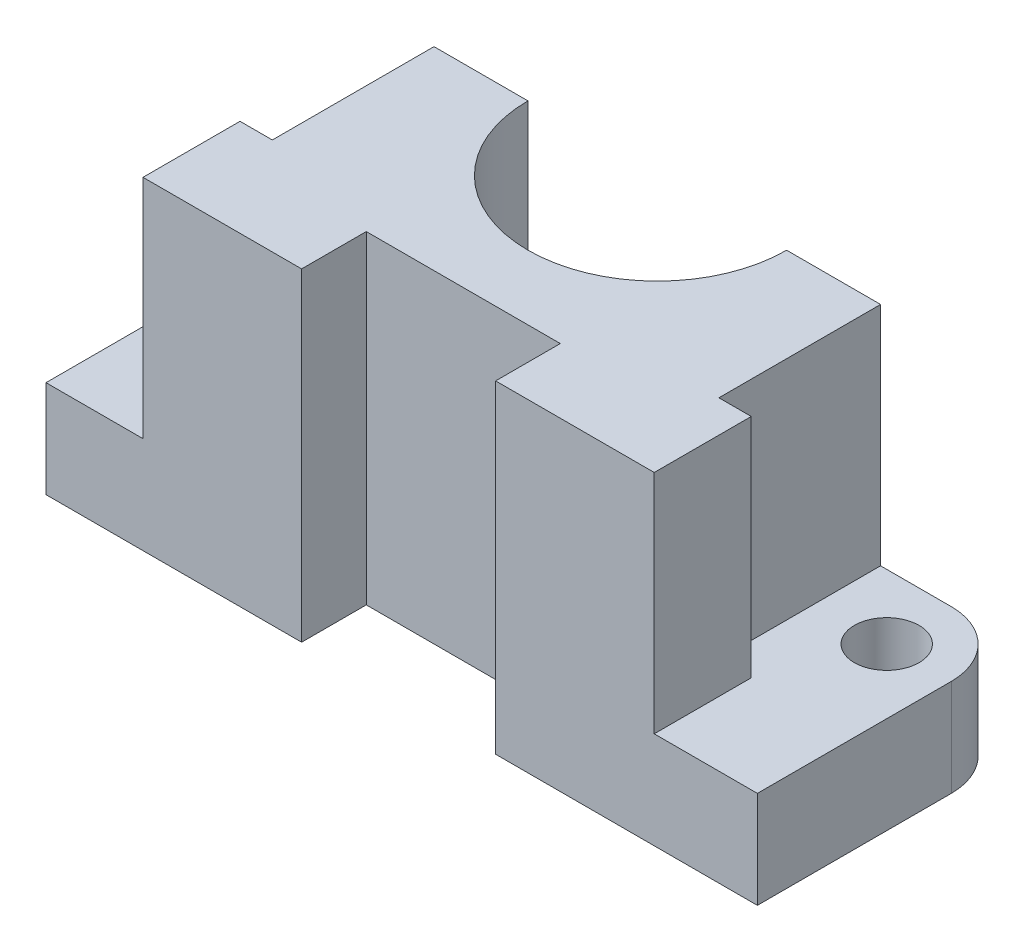
ISO-10303-21;
HEADER;
FILE_DESCRIPTION(('STEP AP214'),'2;1');
FILE_NAME('part.step','',(''),(''),'','','');
FILE_SCHEMA(('AUTOMOTIVE_DESIGN { 1 0 10303 214 1 1 1 1 }'));
ENDSEC;
DATA;
#1=APPLICATION_CONTEXT('core data for automotive mechanical design processes');
#2=APPLICATION_PROTOCOL_DEFINITION('international standard','automotive_design',2000,#1);
#3=PRODUCT_CONTEXT('',#1,'mechanical');
#4=PRODUCT('Part','Part','',(#3));
#5=PRODUCT_RELATED_PRODUCT_CATEGORY('part','',(#4));
#6=PRODUCT_DEFINITION_FORMATION('','',#4);
#7=PRODUCT_DEFINITION_CONTEXT('part definition',#1,'design');
#8=PRODUCT_DEFINITION('design','',#6,#7);
#9=PRODUCT_DEFINITION_SHAPE('','',#8);
#10=(LENGTH_UNIT() NAMED_UNIT(*) SI_UNIT(.MILLI.,.METRE.));
#11=(NAMED_UNIT(*) PLANE_ANGLE_UNIT() SI_UNIT($,.RADIAN.));
#12=(NAMED_UNIT(*) SI_UNIT($,.STERADIAN.) SOLID_ANGLE_UNIT());
#13=UNCERTAINTY_MEASURE_WITH_UNIT(LENGTH_MEASURE(1.E-05),#10,'distance_accuracy_value','');
#14=(GEOMETRIC_REPRESENTATION_CONTEXT(3) GLOBAL_UNCERTAINTY_ASSIGNED_CONTEXT((#13)) GLOBAL_UNIT_ASSIGNED_CONTEXT((#10,
#11,#12)) REPRESENTATION_CONTEXT('',''));
#15=CARTESIAN_POINT('',(0.,0.,0.));
#16=DIRECTION('',(0.,0.,1.));
#17=DIRECTION('',(1.,0.,0.));
#18=AXIS2_PLACEMENT_3D('',#15,#16,#17);
#19=CARTESIAN_POINT('',(99.9999999999999,50.,-40.));
#20=DIRECTION('',(0.,0.,1.));
#21=DIRECTION('',(1.,0.,0.));
#22=AXIS2_PLACEMENT_3D('',#19,#20,#21);
#23=PLANE('',#22);
#24=DIRECTION('',(-1.,0.,0.));
#25=VECTOR('',#24,1.);
#26=CARTESIAN_POINT('',(99.9999999999999,0.,-40.));
#27=LINE('',#26,#25);
#28=CARTESIAN_POINT('',(99.9999999999999,0.,-40.));
#29=VERTEX_POINT('',#28);
#30=CARTESIAN_POINT('',(64.5261628445037,0.,-40.));
#31=VERTEX_POINT('',#30);
#32=EDGE_CURVE('E213',#29,#31,#27,.T.);
#33=ORIENTED_EDGE('',*,*,#32,.T.);
#34=DIRECTION('',(0.,1.,0.));
#35=VECTOR('',#34,1.);
#36=CARTESIAN_POINT('',(64.5261628445037,0.,-40.));
#37=LINE('',#36,#35);
#38=CARTESIAN_POINT('',(64.5261628445037,30.,-40.));
#39=VERTEX_POINT('',#38);
#40=EDGE_CURVE('E192',#31,#39,#37,.T.);
#41=ORIENTED_EDGE('',*,*,#40,.T.);
#42=DIRECTION('',(-1.,0.,0.));
#43=VECTOR('',#42,1.);
#44=CARTESIAN_POINT('',(0.,30.,-40.));
#45=LINE('',#44,#43);
#46=CARTESIAN_POINT('',(74.5261628445037,30.,-40.));
#47=VERTEX_POINT('',#46);
#48=EDGE_CURVE('E439',#47,#39,#45,.T.);
#49=ORIENTED_EDGE('',*,*,#48,.F.);
#50=DIRECTION('',(0.,1.,0.));
#51=VECTOR('',#50,1.);
#52=CARTESIAN_POINT('',(74.5261628445037,30.,-40.));
#53=LINE('',#52,#51);
#54=CARTESIAN_POINT('',(74.5261628445037,50.,-40.));
#55=VERTEX_POINT('',#54);
#56=EDGE_CURVE('E436',#47,#55,#53,.T.);
#57=ORIENTED_EDGE('',*,*,#56,.T.);
#58=DIRECTION('',(-1.,0.,0.));
#59=VECTOR('',#58,1.);
#60=CARTESIAN_POINT('',(99.9999999999999,50.,-40.));
#61=LINE('',#60,#59);
#62=CARTESIAN_POINT('',(89.0523256890073,50.,-40.));
#63=VERTEX_POINT('',#62);
#64=EDGE_CURVE('E226',#63,#55,#61,.T.);
#65=ORIENTED_EDGE('',*,*,#64,.F.);
#66=DIRECTION('',(0.,1.,0.));
#67=VECTOR('',#66,1.);
#68=CARTESIAN_POINT('',(89.0523256890073,15.,-40.));
#69=LINE('',#68,#67);
#70=CARTESIAN_POINT('',(89.0523256890073,15.,-40.));
#71=VERTEX_POINT('',#70);
#72=EDGE_CURVE('E357',#71,#63,#69,.T.);
#73=ORIENTED_EDGE('',*,*,#72,.F.);
#74=DIRECTION('',(-1.,0.,0.));
#75=VECTOR('',#74,1.);
#76=CARTESIAN_POINT('',(0.,15.,-40.));
#77=LINE('',#76,#75);
#78=CARTESIAN_POINT('',(99.9999999999999,15.,-40.));
#79=VERTEX_POINT('',#78);
#80=EDGE_CURVE('E334',#79,#71,#77,.T.);
#81=ORIENTED_EDGE('',*,*,#80,.F.);
#82=DIRECTION('',(0.,-1.,0.));
#83=VECTOR('',#82,1.);
#84=CARTESIAN_POINT('',(99.9999999999999,50.,-40.));
#85=LINE('',#84,#83);
#86=EDGE_CURVE('E228',#79,#29,#85,.T.);
#87=ORIENTED_EDGE('',*,*,#86,.T.);
#88=EDGE_LOOP('',(#33,#41,#49,#57,#65,#73,#81,#87));
#89=FACE_BOUND('',#88,.T.);
#90=ADVANCED_FACE('F41',(#89),#23,.F.);
#91=CARTESIAN_POINT('',(100.,50.,-30.));
#92=DIRECTION('',(0.,1.,0.));
#93=DIRECTION('',(0.,0.,1.));
#94=AXIS2_PLACEMENT_3D('',#91,#92,#93);
#95=PLANE('',#94);
#96=CARTESIAN_POINT('',(54.5261628445037,50.,-40.));
#97=DIRECTION('',(0.,1.,0.));
#98=DIRECTION('',(0.,0.,1.));
#99=AXIS2_PLACEMENT_3D('',#96,#97,#98);
#100=CIRCLE('',#99,20.);
#101=CARTESIAN_POINT('',(34.5261628445037,50.,-40.));
#102=VERTEX_POINT('',#101);
#103=EDGE_CURVE('E430',#102,#55,#100,.T.);
#104=ORIENTED_EDGE('',*,*,#103,.F.);
#105=CARTESIAN_POINT('',(20.,50.,-40.));
#106=VERTEX_POINT('',#105);
#107=EDGE_CURVE('E308',#102,#106,#61,.T.);
#108=ORIENTED_EDGE('',*,*,#107,.T.);
#109=DIRECTION('',(0.,0.,1.));
#110=VECTOR('',#109,1.);
#111=CARTESIAN_POINT('',(20.,50.,-30.));
#112=LINE('',#111,#110);
#113=CARTESIAN_POINT('',(20.,50.,-15.));
#114=VERTEX_POINT('',#113);
#115=EDGE_CURVE('E244',#106,#114,#112,.T.);
#116=ORIENTED_EDGE('',*,*,#115,.T.);
#117=DIRECTION('',(-1.,0.,0.));
#118=VECTOR('',#117,1.);
#119=CARTESIAN_POINT('',(100.,50.,-15.));
#120=LINE('',#119,#118);
#121=CARTESIAN_POINT('',(15.,50.,-15.));
#122=VERTEX_POINT('',#121);
#123=EDGE_CURVE('E49',#114,#122,#120,.T.);
#124=ORIENTED_EDGE('',*,*,#123,.T.);
#125=DIRECTION('',(0.,0.,1.));
#126=VECTOR('',#125,1.);
#127=CARTESIAN_POINT('',(15.,50.,-30.));
#128=LINE('',#127,#126);
#129=CARTESIAN_POINT('',(15.,50.,0.));
#130=VERTEX_POINT('',#129);
#131=EDGE_CURVE('E241',#122,#130,#128,.T.);
#132=ORIENTED_EDGE('',*,*,#131,.T.);
#133=DIRECTION('',(1.,0.,0.));
#134=VECTOR('',#133,1.);
#135=CARTESIAN_POINT('',(0.,50.,0.));
#136=LINE('',#135,#134);
#137=CARTESIAN_POINT('',(39.5261628445037,50.,0.));
#138=VERTEX_POINT('',#137);
#139=EDGE_CURVE('E306',#130,#138,#136,.T.);
#140=ORIENTED_EDGE('',*,*,#139,.T.);
#141=DIRECTION('',(0.,0.,-1.));
#142=VECTOR('',#141,1.);
#143=CARTESIAN_POINT('',(39.5261628445037,50.,-30.));
#144=LINE('',#143,#142);
#145=CARTESIAN_POINT('',(39.5261628445037,50.,-10.));
#146=VERTEX_POINT('',#145);
#147=EDGE_CURVE('E294',#138,#146,#144,.T.);
#148=ORIENTED_EDGE('',*,*,#147,.T.);
#149=DIRECTION('',(-1.,0.,0.));
#150=VECTOR('',#149,1.);
#151=CARTESIAN_POINT('',(100.,50.,-10.));
#152=LINE('',#151,#150);
#153=CARTESIAN_POINT('',(69.5261628445037,50.,-10.));
#154=VERTEX_POINT('',#153);
#155=EDGE_CURVE('E297',#154,#146,#152,.T.);
#156=ORIENTED_EDGE('',*,*,#155,.F.);
#157=DIRECTION('',(0.,0.,-1.));
#158=VECTOR('',#157,1.);
#159=CARTESIAN_POINT('',(69.5261628445037,50.,-30.));
#160=LINE('',#159,#158);
#161=CARTESIAN_POINT('',(69.5261628445037,50.,0.));
#162=VERTEX_POINT('',#161);
#163=EDGE_CURVE('E285',#162,#154,#160,.T.);
#164=ORIENTED_EDGE('',*,*,#163,.F.);
#165=CARTESIAN_POINT('',(94.0523256890073,50.,0.));
#166=VERTEX_POINT('',#165);
#167=EDGE_CURVE('E222',#162,#166,#136,.T.);
#168=ORIENTED_EDGE('',*,*,#167,.T.);
#169=DIRECTION('',(0.,0.,-1.));
#170=VECTOR('',#169,1.);
#171=CARTESIAN_POINT('',(94.0523256890073,50.,-30.));
#172=LINE('',#171,#170);
#173=CARTESIAN_POINT('',(94.0523256890073,50.,-15.));
#174=VERTEX_POINT('',#173);
#175=EDGE_CURVE('E269',#166,#174,#172,.T.);
#176=ORIENTED_EDGE('',*,*,#175,.T.);
#177=DIRECTION('',(-1.,0.,0.));
#178=VECTOR('',#177,1.);
#179=CARTESIAN_POINT('',(100.,50.,-15.));
#180=LINE('',#179,#178);
#181=CARTESIAN_POINT('',(89.0523256890073,50.,-15.));
#182=VERTEX_POINT('',#181);
#183=EDGE_CURVE('E11',#174,#182,#180,.T.);
#184=ORIENTED_EDGE('',*,*,#183,.T.);
#185=DIRECTION('',(0.,0.,-1.));
#186=VECTOR('',#185,1.);
#187=CARTESIAN_POINT('',(89.0523256890073,50.,-30.));
#188=LINE('',#187,#186);
#189=EDGE_CURVE('E261',#182,#63,#188,.T.);
#190=ORIENTED_EDGE('',*,*,#189,.T.);
#191=ORIENTED_EDGE('',*,*,#64,.T.);
#192=EDGE_LOOP('',(#104,#108,#116,#124,#132,#140,#148,#156,#164,#168,#176,#184,#190,#191));
#193=FACE_BOUND('',#192,.T.);
#194=ADVANCED_FACE('F240',(#193),#95,.T.);
#195=CARTESIAN_POINT('',(0.,50.,0.));
#196=DIRECTION('',(0.,0.,-1.));
#197=DIRECTION('',(-1.,0.,0.));
#198=AXIS2_PLACEMENT_3D('',#195,#196,#197);
#199=PLANE('',#198);
#200=DIRECTION('',(0.,-1.,0.));
#201=VECTOR('',#200,1.);
#202=CARTESIAN_POINT('',(15.,50.000012,0.));
#203=LINE('',#202,#201);
#204=CARTESIAN_POINT('',(15.,15.,0.));
#205=VERTEX_POINT('',#204);
#206=EDGE_CURVE('E263',#130,#205,#203,.T.);
#207=ORIENTED_EDGE('',*,*,#206,.T.);
#208=DIRECTION('',(1.,0.,0.));
#209=VECTOR('',#208,1.);
#210=CARTESIAN_POINT('',(0.,15.,0.));
#211=LINE('',#210,#209);
#212=CARTESIAN_POINT('',(0.,15.,0.));
#213=VERTEX_POINT('',#212);
#214=EDGE_CURVE('E372',#213,#205,#211,.T.);
#215=ORIENTED_EDGE('',*,*,#214,.F.);
#216=DIRECTION('',(0.,-1.,0.));
#217=VECTOR('',#216,1.);
#218=CARTESIAN_POINT('',(0.,50.,0.));
#219=LINE('',#218,#217);
#220=CARTESIAN_POINT('',(0.,0.,0.));
#221=VERTEX_POINT('',#220);
#222=EDGE_CURVE('E234',#213,#221,#219,.T.);
#223=ORIENTED_EDGE('',*,*,#222,.T.);
#224=DIRECTION('',(1.,0.,0.));
#225=VECTOR('',#224,1.);
#226=CARTESIAN_POINT('',(0.,0.,0.));
#227=LINE('',#226,#225);
#228=CARTESIAN_POINT('',(39.5261628445037,0.,0.));
#229=VERTEX_POINT('',#228);
#230=EDGE_CURVE('E314',#221,#229,#227,.T.);
#231=ORIENTED_EDGE('',*,*,#230,.T.);
#232=DIRECTION('',(0.,1.,0.));
#233=VECTOR('',#232,1.);
#234=CARTESIAN_POINT('',(39.5261628445037,0.,0.));
#235=LINE('',#234,#233);
#236=EDGE_CURVE('E281',#229,#138,#235,.T.);
#237=ORIENTED_EDGE('',*,*,#236,.T.);
#238=ORIENTED_EDGE('',*,*,#139,.F.);
#239=EDGE_LOOP('',(#207,#215,#223,#231,#237,#238));
#240=FACE_BOUND('',#239,.T.);
#241=ADVANCED_FACE('F380',(#240),#199,.F.);
#242=CARTESIAN_POINT('',(0.,50.,-29.9999999999999));
#243=DIRECTION('',(1.,0.,0.));
#244=DIRECTION('',(0.,0.,-1.));
#245=AXIS2_PLACEMENT_3D('',#242,#243,#244);
#246=PLANE('',#245);
#247=DIRECTION('',(0.,0.,1.));
#248=VECTOR('',#247,1.);
#249=CARTESIAN_POINT('',(0.,15.,0.));
#250=LINE('',#249,#248);
#251=CARTESIAN_POINT('',(0.,15.,-29.9999999999999));
#252=VERTEX_POINT('',#251);
#253=EDGE_CURVE('E370',#252,#213,#250,.T.);
#254=ORIENTED_EDGE('',*,*,#253,.F.);
#255=DIRECTION('',(0.,-1.,0.));
#256=VECTOR('',#255,1.);
#257=CARTESIAN_POINT('',(0.,50.,-29.9999999999999));
#258=LINE('',#257,#256);
#259=CARTESIAN_POINT('',(0.,0.,-29.9999999999999));
#260=VERTEX_POINT('',#259);
#261=EDGE_CURVE('E223',#252,#260,#258,.T.);
#262=ORIENTED_EDGE('',*,*,#261,.T.);
#263=DIRECTION('',(0.,0.,1.));
#264=VECTOR('',#263,1.);
#265=CARTESIAN_POINT('',(0.,0.,-29.9999999999999));
#266=LINE('',#265,#264);
#267=EDGE_CURVE('E305',#260,#221,#266,.T.);
#268=ORIENTED_EDGE('',*,*,#267,.T.);
#269=ORIENTED_EDGE('',*,*,#222,.F.);
#270=EDGE_LOOP('',(#254,#262,#268,#269));
#271=FACE_BOUND('',#270,.T.);
#272=ADVANCED_FACE('F43',(#271),#246,.F.);
#273=DIRECTION('',(0.,1.,0.));
#274=VECTOR('',#273,1.);
#275=CARTESIAN_POINT('',(94.0523256890073,15.,0.));
#276=LINE('',#275,#274);
#277=CARTESIAN_POINT('',(94.0523256890073,15.,0.));
#278=VERTEX_POINT('',#277);
#279=EDGE_CURVE('E349',#278,#166,#276,.T.);
#280=ORIENTED_EDGE('',*,*,#279,.T.);
#281=ORIENTED_EDGE('',*,*,#167,.F.);
#282=DIRECTION('',(0.,1.,0.));
#283=VECTOR('',#282,1.);
#284=CARTESIAN_POINT('',(69.5261628445037,0.,0.));
#285=LINE('',#284,#283);
#286=CARTESIAN_POINT('',(69.5261628445037,0.,0.));
#287=VERTEX_POINT('',#286);
#288=EDGE_CURVE('E289',#287,#162,#285,.T.);
#289=ORIENTED_EDGE('',*,*,#288,.F.);
#290=CARTESIAN_POINT('',(110.,0.,0.));
#291=VERTEX_POINT('',#290);
#292=EDGE_CURVE('E313',#287,#291,#227,.T.);
#293=ORIENTED_EDGE('',*,*,#292,.T.);
#294=DIRECTION('',(0.,-1.,0.));
#295=VECTOR('',#294,1.);
#296=CARTESIAN_POINT('',(110.,50.,0.));
#297=LINE('',#296,#295);
#298=CARTESIAN_POINT('',(110.,15.,0.));
#299=VERTEX_POINT('',#298);
#300=EDGE_CURVE('E232',#299,#291,#297,.T.);
#301=ORIENTED_EDGE('',*,*,#300,.F.);
#302=DIRECTION('',(1.,0.,0.));
#303=VECTOR('',#302,1.);
#304=CARTESIAN_POINT('',(0.,15.,0.));
#305=LINE('',#304,#303);
#306=EDGE_CURVE('E339',#278,#299,#305,.T.);
#307=ORIENTED_EDGE('',*,*,#306,.F.);
#308=EDGE_LOOP('',(#280,#281,#289,#293,#301,#307));
#309=FACE_BOUND('',#308,.T.);
#310=ADVANCED_FACE('F410',(#309),#199,.F.);
#311=CARTESIAN_POINT('',(110.,50.,0.));
#312=DIRECTION('',(-1.,0.,0.));
#313=DIRECTION('',(0.,0.,1.));
#314=AXIS2_PLACEMENT_3D('',#311,#312,#313);
#315=PLANE('',#314);
#316=DIRECTION('',(0.,0.,-1.));
#317=VECTOR('',#316,1.);
#318=CARTESIAN_POINT('',(110.,15.,0.));
#319=LINE('',#318,#317);
#320=CARTESIAN_POINT('',(110.,15.,-29.9999999999999));
#321=VERTEX_POINT('',#320);
#322=EDGE_CURVE('E335',#299,#321,#319,.T.);
#323=ORIENTED_EDGE('',*,*,#322,.F.);
#324=ORIENTED_EDGE('',*,*,#300,.T.);
#325=DIRECTION('',(0.,0.,-1.));
#326=VECTOR('',#325,1.);
#327=CARTESIAN_POINT('',(110.,0.,0.));
#328=LINE('',#327,#326);
#329=CARTESIAN_POINT('',(110.,0.,-29.9999999999999));
#330=VERTEX_POINT('',#329);
#331=EDGE_CURVE('E217',#291,#330,#328,.T.);
#332=ORIENTED_EDGE('',*,*,#331,.T.);
#333=DIRECTION('',(0.,-1.,0.));
#334=VECTOR('',#333,1.);
#335=CARTESIAN_POINT('',(110.,50.,-29.9999999999999));
#336=LINE('',#335,#334);
#337=EDGE_CURVE('E230',#321,#330,#336,.T.);
#338=ORIENTED_EDGE('',*,*,#337,.F.);
#339=EDGE_LOOP('',(#323,#324,#332,#338));
#340=FACE_BOUND('',#339,.T.);
#341=ADVANCED_FACE('F322',(#340),#315,.F.);
#342=CARTESIAN_POINT('',(100.,50.,-30.));
#343=DIRECTION('',(0.,-1.,0.));
#344=DIRECTION('',(0.,0.,-1.));
#345=AXIS2_PLACEMENT_3D('',#342,#343,#344);
#346=CYLINDRICAL_SURFACE('',#345,10.);
#347=CARTESIAN_POINT('',(100.,15.,-30.));
#348=DIRECTION('',(0.,1.,0.));
#349=DIRECTION('',(0.,0.,1.));
#350=AXIS2_PLACEMENT_3D('',#347,#348,#349);
#351=CIRCLE('',#350,10.);
#352=EDGE_CURVE('E330',#321,#79,#351,.T.);
#353=ORIENTED_EDGE('',*,*,#352,.F.);
#354=ORIENTED_EDGE('',*,*,#337,.T.);
#355=CARTESIAN_POINT('',(100.,0.,-30.));
#356=DIRECTION('',(0.,1.,0.));
#357=DIRECTION('',(0.,0.,1.));
#358=AXIS2_PLACEMENT_3D('',#355,#356,#357);
#359=CIRCLE('',#358,10.);
#360=EDGE_CURVE('E214',#330,#29,#359,.T.);
#361=ORIENTED_EDGE('',*,*,#360,.T.);
#362=ORIENTED_EDGE('',*,*,#86,.F.);
#363=EDGE_LOOP('',(#353,#354,#361,#362));
#364=FACE_BOUND('',#363,.T.);
#365=ADVANCED_FACE('F329',(#364),#346,.T.);
#366=CARTESIAN_POINT('',(44.5261628445037,30.,-40.));
#367=VERTEX_POINT('',#366);
#368=CARTESIAN_POINT('',(34.5261628445037,30.,-40.));
#369=VERTEX_POINT('',#368);
#370=EDGE_CURVE('E206',#367,#369,#45,.T.);
#371=ORIENTED_EDGE('',*,*,#370,.F.);
#372=DIRECTION('',(0.,1.,0.));
#373=VECTOR('',#372,1.);
#374=CARTESIAN_POINT('',(44.5261628445037,0.,-40.));
#375=LINE('',#374,#373);
#376=CARTESIAN_POINT('',(44.5261628445037,0.,-40.));
#377=VERTEX_POINT('',#376);
#378=EDGE_CURVE('E56',#377,#367,#375,.T.);
#379=ORIENTED_EDGE('',*,*,#378,.F.);
#380=CARTESIAN_POINT('',(10.0000000000001,0.,-40.));
#381=VERTEX_POINT('',#380);
#382=EDGE_CURVE('E203',#377,#381,#27,.T.);
#383=ORIENTED_EDGE('',*,*,#382,.T.);
#384=DIRECTION('',(0.,-1.,0.));
#385=VECTOR('',#384,1.);
#386=CARTESIAN_POINT('',(10.0000000000001,50.,-40.));
#387=LINE('',#386,#385);
#388=CARTESIAN_POINT('',(10.0000000000001,15.,-40.));
#389=VERTEX_POINT('',#388);
#390=EDGE_CURVE('E225',#389,#381,#387,.T.);
#391=ORIENTED_EDGE('',*,*,#390,.F.);
#392=DIRECTION('',(-1.,0.,0.));
#393=VECTOR('',#392,1.);
#394=CARTESIAN_POINT('',(0.,15.,-40.));
#395=LINE('',#394,#393);
#396=CARTESIAN_POINT('',(20.,15.,-40.));
#397=VERTEX_POINT('',#396);
#398=EDGE_CURVE('E366',#397,#389,#395,.T.);
#399=ORIENTED_EDGE('',*,*,#398,.F.);
#400=DIRECTION('',(0.,-1.,0.));
#401=VECTOR('',#400,1.);
#402=CARTESIAN_POINT('',(20.,50.000012,-40.));
#403=LINE('',#402,#401);
#404=EDGE_CURVE('E259',#106,#397,#403,.T.);
#405=ORIENTED_EDGE('',*,*,#404,.F.);
#406=ORIENTED_EDGE('',*,*,#107,.F.);
#407=DIRECTION('',(0.,1.,0.));
#408=VECTOR('',#407,1.);
#409=CARTESIAN_POINT('',(34.5261628445037,30.,-40.));
#410=LINE('',#409,#408);
#411=EDGE_CURVE('E434',#369,#102,#410,.T.);
#412=ORIENTED_EDGE('',*,*,#411,.F.);
#413=EDGE_LOOP('',(#371,#379,#383,#391,#399,#405,#406,#412));
#414=FACE_BOUND('',#413,.T.);
#415=ADVANCED_FACE('F201',(#414),#23,.F.);
#416=CARTESIAN_POINT('',(10.,50.,-30.));
#417=DIRECTION('',(0.,-1.,0.));
#418=DIRECTION('',(0.,0.,-1.));
#419=AXIS2_PLACEMENT_3D('',#416,#417,#418);
#420=CYLINDRICAL_SURFACE('',#419,10.);
#421=CARTESIAN_POINT('',(10.,15.,-30.));
#422=DIRECTION('',(0.,1.,0.));
#423=DIRECTION('',(0.,0.,1.));
#424=AXIS2_PLACEMENT_3D('',#421,#422,#423);
#425=CIRCLE('',#424,10.);
#426=EDGE_CURVE('E368',#389,#252,#425,.T.);
#427=ORIENTED_EDGE('',*,*,#426,.F.);
#428=ORIENTED_EDGE('',*,*,#390,.T.);
#429=CARTESIAN_POINT('',(10.,0.,-30.));
#430=DIRECTION('',(0.,1.,0.));
#431=DIRECTION('',(0.,0.,1.));
#432=AXIS2_PLACEMENT_3D('',#429,#430,#431);
#433=CIRCLE('',#432,10.);
#434=EDGE_CURVE('E212',#381,#260,#433,.T.);
#435=ORIENTED_EDGE('',*,*,#434,.T.);
#436=ORIENTED_EDGE('',*,*,#261,.F.);
#437=EDGE_LOOP('',(#427,#428,#435,#436));
#438=FACE_BOUND('',#437,.T.);
#439=ADVANCED_FACE('F392',(#438),#420,.T.);
#440=CARTESIAN_POINT('',(10.,50.,-30.));
#441=DIRECTION('',(0.,-1.,0.));
#442=DIRECTION('',(0.,0.,-1.));
#443=AXIS2_PLACEMENT_3D('',#440,#441,#442);
#444=CYLINDRICAL_SURFACE('',#443,5.);
#445=CARTESIAN_POINT('',(10.,0.,-30.));
#446=DIRECTION('',(0.,1.,0.));
#447=DIRECTION('',(0.,0.,1.));
#448=AXIS2_PLACEMENT_3D('',#445,#446,#447);
#449=CIRCLE('',#448,5.);
#450=CARTESIAN_POINT('',(10.,0.,-25.));
#451=VERTEX_POINT('',#450);
#452=EDGE_CURVE('E302',#451,#451,#449,.T.);
#453=ORIENTED_EDGE('',*,*,#452,.F.);
#454=EDGE_LOOP('',(#453));
#455=FACE_BOUND('',#454,.T.);
#456=CARTESIAN_POINT('',(10.,15.,-30.));
#457=DIRECTION('',(0.,1.,0.));
#458=DIRECTION('',(0.,0.,1.));
#459=AXIS2_PLACEMENT_3D('',#456,#457,#458);
#460=CIRCLE('',#459,5.);
#461=CARTESIAN_POINT('',(10.,15.,-25.));
#462=VERTEX_POINT('',#461);
#463=EDGE_CURVE('E353',#462,#462,#460,.F.);
#464=ORIENTED_EDGE('',*,*,#463,.F.);
#465=EDGE_LOOP('',(#464));
#466=FACE_BOUND('',#465,.T.);
#467=ADVANCED_FACE('F469',(#455,#466),#444,.F.);
#468=CARTESIAN_POINT('',(100.,50.,-30.));
#469=DIRECTION('',(0.,-1.,0.));
#470=DIRECTION('',(0.,0.,-1.));
#471=AXIS2_PLACEMENT_3D('',#468,#469,#470);
#472=CYLINDRICAL_SURFACE('',#471,5.);
#473=CARTESIAN_POINT('',(100.,0.,-30.));
#474=DIRECTION('',(0.,1.,0.));
#475=DIRECTION('',(0.,0.,1.));
#476=AXIS2_PLACEMENT_3D('',#473,#474,#475);
#477=CIRCLE('',#476,5.);
#478=CARTESIAN_POINT('',(100.,0.,-25.));
#479=VERTEX_POINT('',#478);
#480=EDGE_CURVE('E299',#479,#479,#477,.T.);
#481=ORIENTED_EDGE('',*,*,#480,.F.);
#482=EDGE_LOOP('',(#481));
#483=FACE_BOUND('',#482,.T.);
#484=CARTESIAN_POINT('',(100.,15.,-30.));
#485=DIRECTION('',(0.,1.,0.));
#486=DIRECTION('',(0.,0.,1.));
#487=AXIS2_PLACEMENT_3D('',#484,#485,#486);
#488=CIRCLE('',#487,5.);
#489=CARTESIAN_POINT('',(100.,15.,-25.));
#490=VERTEX_POINT('',#489);
#491=EDGE_CURVE('E346',#490,#490,#488,.F.);
#492=ORIENTED_EDGE('',*,*,#491,.F.);
#493=EDGE_LOOP('',(#492));
#494=FACE_BOUND('',#493,.T.);
#495=ADVANCED_FACE('F512',(#483,#494),#472,.F.);
#496=CARTESIAN_POINT('',(100.,0.,-30.));
#497=DIRECTION('',(0.,1.,0.));
#498=DIRECTION('',(0.,0.,1.));
#499=AXIS2_PLACEMENT_3D('',#496,#497,#498);
#500=PLANE('',#499);
#501=ORIENTED_EDGE('',*,*,#480,.T.);
#502=EDGE_LOOP('',(#501));
#503=FACE_BOUND('',#502,.T.);
#504=ORIENTED_EDGE('',*,*,#452,.T.);
#505=EDGE_LOOP('',(#504));
#506=FACE_BOUND('',#505,.T.);
#507=ORIENTED_EDGE('',*,*,#382,.F.);
#508=CARTESIAN_POINT('',(54.5261628445037,0.,-40.));
#509=DIRECTION('',(0.,1.,0.));
#510=DIRECTION('',(0.,0.,1.));
#511=AXIS2_PLACEMENT_3D('',#508,#509,#510);
#512=CIRCLE('',#511,9.99999999999999);
#513=EDGE_CURVE('E189',#377,#31,#512,.T.);
#514=ORIENTED_EDGE('',*,*,#513,.T.);
#515=ORIENTED_EDGE('',*,*,#32,.F.);
#516=ORIENTED_EDGE('',*,*,#360,.F.);
#517=ORIENTED_EDGE('',*,*,#331,.F.);
#518=ORIENTED_EDGE('',*,*,#292,.F.);
#519=DIRECTION('',(0.,0.,-1.));
#520=VECTOR('',#519,1.);
#521=CARTESIAN_POINT('',(69.5261628445037,0.,0.));
#522=LINE('',#521,#520);
#523=CARTESIAN_POINT('',(69.5261628445037,0.,-10.));
#524=VERTEX_POINT('',#523);
#525=EDGE_CURVE('E275',#287,#524,#522,.T.);
#526=ORIENTED_EDGE('',*,*,#525,.T.);
#527=DIRECTION('',(-1.,0.,0.));
#528=VECTOR('',#527,1.);
#529=CARTESIAN_POINT('',(0.,0.,-10.));
#530=LINE('',#529,#528);
#531=CARTESIAN_POINT('',(39.5261628445037,0.,-10.));
#532=VERTEX_POINT('',#531);
#533=EDGE_CURVE('E278',#524,#532,#530,.T.);
#534=ORIENTED_EDGE('',*,*,#533,.T.);
#535=DIRECTION('',(0.,0.,-1.));
#536=VECTOR('',#535,1.);
#537=CARTESIAN_POINT('',(39.5261628445037,0.,0.));
#538=LINE('',#537,#536);
#539=EDGE_CURVE('E273',#229,#532,#538,.T.);
#540=ORIENTED_EDGE('',*,*,#539,.F.);
#541=ORIENTED_EDGE('',*,*,#230,.F.);
#542=ORIENTED_EDGE('',*,*,#267,.F.);
#543=ORIENTED_EDGE('',*,*,#434,.F.);
#544=EDGE_LOOP('',(#507,#514,#515,#516,#517,#518,#526,#534,#540,#541,#542,#543));
#545=FACE_BOUND('',#544,.T.);
#546=ADVANCED_FACE('F209',(#503,#506,#545),#500,.F.);
#547=CARTESIAN_POINT('',(39.5261628445037,0.,0.));
#548=DIRECTION('',(1.,0.,0.));
#549=DIRECTION('',(0.,0.,-1.));
#550=AXIS2_PLACEMENT_3D('',#547,#548,#549);
#551=PLANE('',#550);
#552=ORIENTED_EDGE('',*,*,#236,.F.);
#553=ORIENTED_EDGE('',*,*,#539,.T.);
#554=DIRECTION('',(0.,1.,0.));
#555=VECTOR('',#554,1.);
#556=CARTESIAN_POINT('',(39.5261628445037,0.,-10.));
#557=LINE('',#556,#555);
#558=EDGE_CURVE('E282',#532,#146,#557,.T.);
#559=ORIENTED_EDGE('',*,*,#558,.T.);
#560=ORIENTED_EDGE('',*,*,#147,.F.);
#561=EDGE_LOOP('',(#552,#553,#559,#560));
#562=FACE_BOUND('',#561,.T.);
#563=ADVANCED_FACE('F397',(#562),#551,.T.);
#564=CARTESIAN_POINT('',(0.,0.,-10.));
#565=DIRECTION('',(0.,0.,-1.));
#566=DIRECTION('',(-1.,0.,0.));
#567=AXIS2_PLACEMENT_3D('',#564,#565,#566);
#568=PLANE('',#567);
#569=ORIENTED_EDGE('',*,*,#155,.T.);
#570=ORIENTED_EDGE('',*,*,#558,.F.);
#571=ORIENTED_EDGE('',*,*,#533,.F.);
#572=DIRECTION('',(0.,1.,0.));
#573=VECTOR('',#572,1.);
#574=CARTESIAN_POINT('',(69.5261628445037,0.,-10.));
#575=LINE('',#574,#573);
#576=EDGE_CURVE('E286',#524,#154,#575,.T.);
#577=ORIENTED_EDGE('',*,*,#576,.T.);
#578=EDGE_LOOP('',(#569,#570,#571,#577));
#579=FACE_BOUND('',#578,.T.);
#580=ADVANCED_FACE('F404',(#579),#568,.F.);
#581=CARTESIAN_POINT('',(69.5261628445037,0.,0.));
#582=DIRECTION('',(1.,0.,0.));
#583=DIRECTION('',(0.,0.,-1.));
#584=AXIS2_PLACEMENT_3D('',#581,#582,#583);
#585=PLANE('',#584);
#586=ORIENTED_EDGE('',*,*,#163,.T.);
#587=ORIENTED_EDGE('',*,*,#576,.F.);
#588=ORIENTED_EDGE('',*,*,#525,.F.);
#589=ORIENTED_EDGE('',*,*,#288,.T.);
#590=EDGE_LOOP('',(#586,#587,#588,#589));
#591=FACE_BOUND('',#590,.T.);
#592=ADVANCED_FACE('F407',(#591),#585,.F.);
#593=CARTESIAN_POINT('',(94.0523256890073,15.,0.));
#594=DIRECTION('',(1.,0.,0.));
#595=DIRECTION('',(0.,0.,-1.));
#596=AXIS2_PLACEMENT_3D('',#593,#594,#595);
#597=PLANE('',#596);
#598=ORIENTED_EDGE('',*,*,#279,.F.);
#599=DIRECTION('',(0.,0.,-1.));
#600=VECTOR('',#599,1.);
#601=CARTESIAN_POINT('',(94.0523256890073,15.,0.));
#602=LINE('',#601,#600);
#603=CARTESIAN_POINT('',(94.0523256890073,15.,-15.));
#604=VERTEX_POINT('',#603);
#605=EDGE_CURVE('E417',#278,#604,#602,.T.);
#606=ORIENTED_EDGE('',*,*,#605,.T.);
#607=DIRECTION('',(0.,1.,0.));
#608=VECTOR('',#607,1.);
#609=CARTESIAN_POINT('',(94.0523256890073,15.,-15.));
#610=LINE('',#609,#608);
#611=EDGE_CURVE('E350',#604,#174,#610,.T.);
#612=ORIENTED_EDGE('',*,*,#611,.T.);
#613=ORIENTED_EDGE('',*,*,#175,.F.);
#614=EDGE_LOOP('',(#598,#606,#612,#613));
#615=FACE_BOUND('',#614,.T.);
#616=ADVANCED_FACE('F413',(#615),#597,.T.);
#617=CARTESIAN_POINT('',(0.,15.,-15.));
#618=DIRECTION('',(0.,0.,-1.));
#619=DIRECTION('',(-1.,0.,0.));
#620=AXIS2_PLACEMENT_3D('',#617,#618,#619);
#621=PLANE('',#620);
#622=ORIENTED_EDGE('',*,*,#611,.F.);
#623=DIRECTION('',(-1.,0.,0.));
#624=VECTOR('',#623,1.);
#625=CARTESIAN_POINT('',(0.,15.,-15.));
#626=LINE('',#625,#624);
#627=CARTESIAN_POINT('',(89.0523256890073,15.,-15.));
#628=VERTEX_POINT('',#627);
#629=EDGE_CURVE('E344',#604,#628,#626,.T.);
#630=ORIENTED_EDGE('',*,*,#629,.T.);
#631=DIRECTION('',(0.,1.,0.));
#632=VECTOR('',#631,1.);
#633=CARTESIAN_POINT('',(89.0523256890073,15.,-15.));
#634=LINE('',#633,#632);
#635=EDGE_CURVE('E354',#628,#182,#634,.T.);
#636=ORIENTED_EDGE('',*,*,#635,.T.);
#637=ORIENTED_EDGE('',*,*,#183,.F.);
#638=EDGE_LOOP('',(#622,#630,#636,#637));
#639=FACE_BOUND('',#638,.T.);
#640=ADVANCED_FACE('F419',(#639),#621,.T.);
#641=CARTESIAN_POINT('',(89.0523256890073,15.,0.));
#642=DIRECTION('',(1.,0.,0.));
#643=DIRECTION('',(0.,0.,-1.));
#644=AXIS2_PLACEMENT_3D('',#641,#642,#643);
#645=PLANE('',#644);
#646=ORIENTED_EDGE('',*,*,#635,.F.);
#647=DIRECTION('',(0.,0.,-1.));
#648=VECTOR('',#647,1.);
#649=CARTESIAN_POINT('',(89.0523256890073,15.,0.));
#650=LINE('',#649,#648);
#651=EDGE_CURVE('E337',#628,#71,#650,.T.);
#652=ORIENTED_EDGE('',*,*,#651,.T.);
#653=ORIENTED_EDGE('',*,*,#72,.T.);
#654=ORIENTED_EDGE('',*,*,#189,.F.);
#655=EDGE_LOOP('',(#646,#652,#653,#654));
#656=FACE_BOUND('',#655,.T.);
#657=ADVANCED_FACE('F423',(#656),#645,.T.);
#658=CARTESIAN_POINT('',(0.,15.,0.));
#659=DIRECTION('',(0.,1.,0.));
#660=DIRECTION('',(0.,0.,1.));
#661=AXIS2_PLACEMENT_3D('',#658,#659,#660);
#662=PLANE('',#661);
#663=ORIENTED_EDGE('',*,*,#605,.F.);
#664=ORIENTED_EDGE('',*,*,#306,.T.);
#665=ORIENTED_EDGE('',*,*,#322,.T.);
#666=ORIENTED_EDGE('',*,*,#352,.T.);
#667=ORIENTED_EDGE('',*,*,#80,.T.);
#668=ORIENTED_EDGE('',*,*,#651,.F.);
#669=ORIENTED_EDGE('',*,*,#629,.F.);
#670=EDGE_LOOP('',(#663,#664,#665,#666,#667,#668,#669));
#671=FACE_BOUND('',#670,.T.);
#672=ORIENTED_EDGE('',*,*,#491,.T.);
#673=EDGE_LOOP('',(#672));
#674=FACE_BOUND('',#673,.T.);
#675=ADVANCED_FACE('F424',(#671,#674),#662,.T.);
#676=CARTESIAN_POINT('',(0.,50.000012,-15.));
#677=DIRECTION('',(0.,0.,-1.));
#678=DIRECTION('',(-1.,0.,0.));
#679=AXIS2_PLACEMENT_3D('',#676,#677,#678);
#680=PLANE('',#679);
#681=DIRECTION('',(0.,-1.,0.));
#682=VECTOR('',#681,1.);
#683=CARTESIAN_POINT('',(20.,50.000012,-15.));
#684=LINE('',#683,#682);
#685=CARTESIAN_POINT('',(20.,15.,-15.));
#686=VERTEX_POINT('',#685);
#687=EDGE_CURVE('E250',#114,#686,#684,.T.);
#688=ORIENTED_EDGE('',*,*,#687,.T.);
#689=DIRECTION('',(1.,0.,0.));
#690=VECTOR('',#689,1.);
#691=CARTESIAN_POINT('',(0.,15.,-15.));
#692=LINE('',#691,#690);
#693=CARTESIAN_POINT('',(15.,15.,-15.));
#694=VERTEX_POINT('',#693);
#695=EDGE_CURVE('E363',#694,#686,#692,.T.);
#696=ORIENTED_EDGE('',*,*,#695,.F.);
#697=DIRECTION('',(0.,-1.,0.));
#698=VECTOR('',#697,1.);
#699=CARTESIAN_POINT('',(15.,50.000012,-15.));
#700=LINE('',#699,#698);
#701=EDGE_CURVE('E252',#122,#694,#700,.T.);
#702=ORIENTED_EDGE('',*,*,#701,.F.);
#703=ORIENTED_EDGE('',*,*,#123,.F.);
#704=EDGE_LOOP('',(#688,#696,#702,#703));
#705=FACE_BOUND('',#704,.T.);
#706=ADVANCED_FACE('F248',(#705),#680,.T.);
#707=CARTESIAN_POINT('',(20.,50.000012,0.));
#708=DIRECTION('',(-1.,0.,0.));
#709=DIRECTION('',(0.,0.,1.));
#710=AXIS2_PLACEMENT_3D('',#707,#708,#709);
#711=PLANE('',#710);
#712=ORIENTED_EDGE('',*,*,#404,.T.);
#713=DIRECTION('',(0.,0.,-1.));
#714=VECTOR('',#713,1.);
#715=CARTESIAN_POINT('',(20.,15.,0.));
#716=LINE('',#715,#714);
#717=EDGE_CURVE('E257',#686,#397,#716,.T.);
#718=ORIENTED_EDGE('',*,*,#717,.F.);
#719=ORIENTED_EDGE('',*,*,#687,.F.);
#720=ORIENTED_EDGE('',*,*,#115,.F.);
#721=EDGE_LOOP('',(#712,#718,#719,#720));
#722=FACE_BOUND('',#721,.T.);
#723=ADVANCED_FACE('F254',(#722),#711,.T.);
#724=CARTESIAN_POINT('',(15.,50.000012,0.));
#725=DIRECTION('',(-1.,0.,0.));
#726=DIRECTION('',(0.,0.,1.));
#727=AXIS2_PLACEMENT_3D('',#724,#725,#726);
#728=PLANE('',#727);
#729=ORIENTED_EDGE('',*,*,#701,.T.);
#730=DIRECTION('',(0.,0.,-1.));
#731=VECTOR('',#730,1.);
#732=CARTESIAN_POINT('',(15.,15.,0.));
#733=LINE('',#732,#731);
#734=EDGE_CURVE('E374',#205,#694,#733,.T.);
#735=ORIENTED_EDGE('',*,*,#734,.F.);
#736=ORIENTED_EDGE('',*,*,#206,.F.);
#737=ORIENTED_EDGE('',*,*,#131,.F.);
#738=EDGE_LOOP('',(#729,#735,#736,#737));
#739=FACE_BOUND('',#738,.T.);
#740=ADVANCED_FACE('F384',(#739),#728,.T.);
#741=CARTESIAN_POINT('',(0.,15.,0.));
#742=DIRECTION('',(0.,1.,0.));
#743=DIRECTION('',(0.,0.,1.));
#744=AXIS2_PLACEMENT_3D('',#741,#742,#743);
#745=PLANE('',#744);
#746=ORIENTED_EDGE('',*,*,#463,.T.);
#747=EDGE_LOOP('',(#746));
#748=FACE_BOUND('',#747,.T.);
#749=ORIENTED_EDGE('',*,*,#695,.T.);
#750=ORIENTED_EDGE('',*,*,#717,.T.);
#751=ORIENTED_EDGE('',*,*,#398,.T.);
#752=ORIENTED_EDGE('',*,*,#426,.T.);
#753=ORIENTED_EDGE('',*,*,#253,.T.);
#754=ORIENTED_EDGE('',*,*,#214,.T.);
#755=ORIENTED_EDGE('',*,*,#734,.T.);
#756=EDGE_LOOP('',(#749,#750,#751,#752,#753,#754,#755));
#757=FACE_BOUND('',#756,.T.);
#758=ADVANCED_FACE('F386',(#748,#757),#745,.T.);
#759=CARTESIAN_POINT('',(54.5261628445037,30.,-40.));
#760=DIRECTION('',(0.,1.,0.));
#761=DIRECTION('',(0.,0.,1.));
#762=AXIS2_PLACEMENT_3D('',#759,#760,#761);
#763=CYLINDRICAL_SURFACE('',#762,20.);
#764=ORIENTED_EDGE('',*,*,#103,.T.);
#765=ORIENTED_EDGE('',*,*,#56,.F.);
#766=CARTESIAN_POINT('',(54.5261628445037,30.,-40.));
#767=DIRECTION('',(0.,1.,0.));
#768=DIRECTION('',(0.,0.,1.));
#769=AXIS2_PLACEMENT_3D('',#766,#767,#768);
#770=CIRCLE('',#769,20.);
#771=EDGE_CURVE('E64',#369,#47,#770,.T.);
#772=ORIENTED_EDGE('',*,*,#771,.F.);
#773=ORIENTED_EDGE('',*,*,#411,.T.);
#774=EDGE_LOOP('',(#764,#765,#772,#773));
#775=FACE_BOUND('',#774,.T.);
#776=ADVANCED_FACE('F448',(#775),#763,.F.);
#777=CARTESIAN_POINT('',(0.,30.,0.));
#778=DIRECTION('',(0.,1.,0.));
#779=DIRECTION('',(0.,0.,1.));
#780=AXIS2_PLACEMENT_3D('',#777,#778,#779);
#781=PLANE('',#780);
#782=CARTESIAN_POINT('',(54.5261628445037,30.,-40.));
#783=DIRECTION('',(0.,1.,0.));
#784=DIRECTION('',(0.,0.,1.));
#785=AXIS2_PLACEMENT_3D('',#782,#783,#784);
#786=CIRCLE('',#785,9.99999999999999);
#787=EDGE_CURVE('E197',#367,#39,#786,.T.);
#788=ORIENTED_EDGE('',*,*,#787,.F.);
#789=ORIENTED_EDGE('',*,*,#370,.T.);
#790=ORIENTED_EDGE('',*,*,#771,.T.);
#791=ORIENTED_EDGE('',*,*,#48,.T.);
#792=EDGE_LOOP('',(#788,#789,#790,#791));
#793=FACE_BOUND('',#792,.T.);
#794=ADVANCED_FACE('F446',(#793),#781,.T.);
#795=CARTESIAN_POINT('',(54.5261628445037,0.,-40.));
#796=DIRECTION('',(0.,1.,0.));
#797=DIRECTION('',(0.,0.,1.));
#798=AXIS2_PLACEMENT_3D('',#795,#796,#797);
#799=CYLINDRICAL_SURFACE('',#798,9.99999999999999);
#800=ORIENTED_EDGE('',*,*,#787,.T.);
#801=ORIENTED_EDGE('',*,*,#40,.F.);
#802=ORIENTED_EDGE('',*,*,#513,.F.);
#803=ORIENTED_EDGE('',*,*,#378,.T.);
#804=EDGE_LOOP('',(#800,#801,#802,#803));
#805=FACE_BOUND('',#804,.T.);
#806=ADVANCED_FACE('F190',(#805),#799,.F.);
#807=CLOSED_SHELL('',(#90,#194,#241,#272,#310,#341,#365,#415,#439,#467,#495,#546,#563,#580,#592,
#616,#640,#657,#675,#706,#723,#740,#758,#776,#794,#806));
#808=MANIFOLD_SOLID_BREP('B2',#807);
#809=ADVANCED_BREP_SHAPE_REPRESENTATION('',(#18,#808),#14);
#810=SHAPE_DEFINITION_REPRESENTATION(#9,#809);
ENDSEC;
END-ISO-10303-21;
